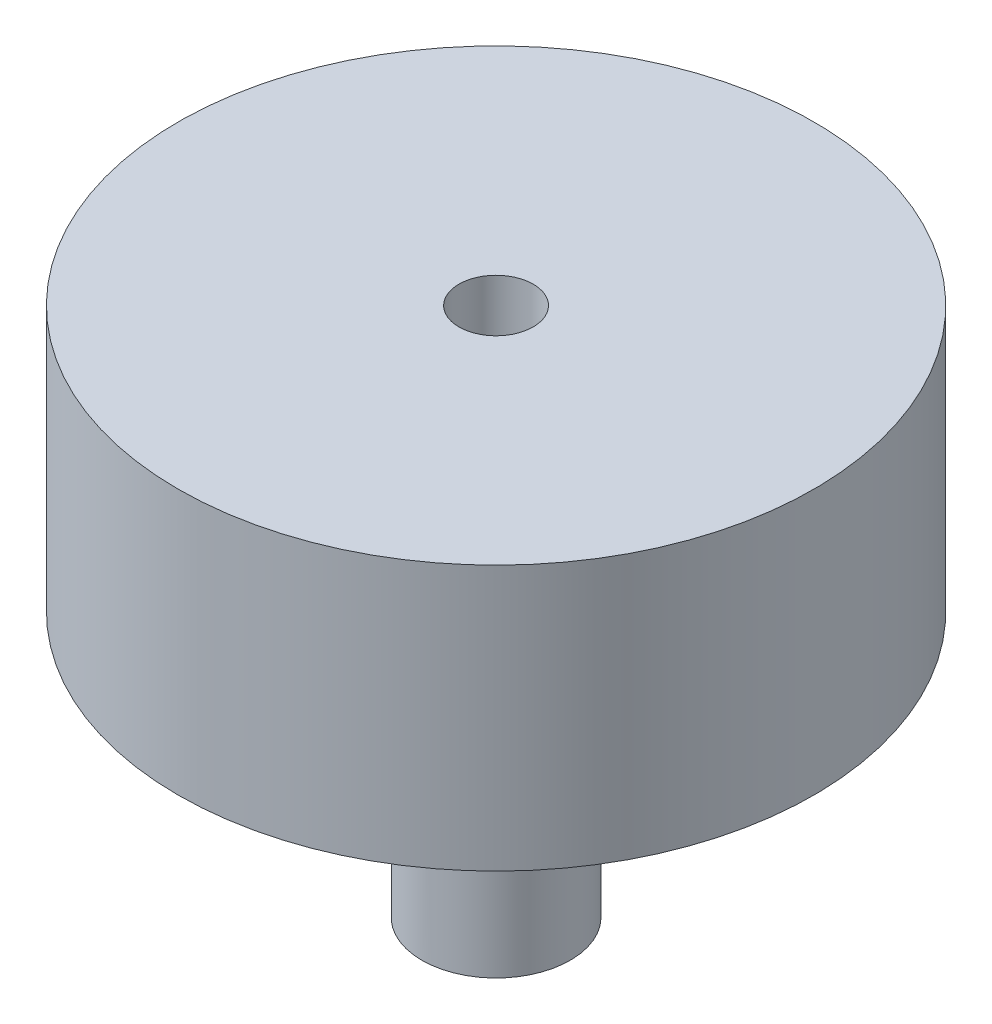
ISO-10303-21;
HEADER;
FILE_DESCRIPTION(('STEP AP214'),'2;1');
FILE_NAME('part.step','',(''),(''),'','','');
FILE_SCHEMA(('AUTOMOTIVE_DESIGN { 1 0 10303 214 1 1 1 1 }'));
ENDSEC;
DATA;
#1=APPLICATION_CONTEXT('core data for automotive mechanical design processes');
#2=APPLICATION_PROTOCOL_DEFINITION('international standard','automotive_design',2000,#1);
#3=PRODUCT_CONTEXT('',#1,'mechanical');
#4=PRODUCT('Part','Part','',(#3));
#5=PRODUCT_RELATED_PRODUCT_CATEGORY('part','',(#4));
#6=PRODUCT_DEFINITION_FORMATION('','',#4);
#7=PRODUCT_DEFINITION_CONTEXT('part definition',#1,'design');
#8=PRODUCT_DEFINITION('design','',#6,#7);
#9=PRODUCT_DEFINITION_SHAPE('','',#8);
#10=(LENGTH_UNIT() NAMED_UNIT(*) SI_UNIT(.MILLI.,.METRE.));
#11=(NAMED_UNIT(*) PLANE_ANGLE_UNIT() SI_UNIT($,.RADIAN.));
#12=(NAMED_UNIT(*) SI_UNIT($,.STERADIAN.) SOLID_ANGLE_UNIT());
#13=UNCERTAINTY_MEASURE_WITH_UNIT(LENGTH_MEASURE(1.E-05),#10,'distance_accuracy_value','');
#14=(GEOMETRIC_REPRESENTATION_CONTEXT(3) GLOBAL_UNCERTAINTY_ASSIGNED_CONTEXT((#13)) GLOBAL_UNIT_ASSIGNED_CONTEXT((#10,
#11,#12)) REPRESENTATION_CONTEXT('',''));
#15=CARTESIAN_POINT('',(0.,0.,0.));
#16=DIRECTION('',(0.,0.,1.));
#17=DIRECTION('',(1.,0.,0.));
#18=AXIS2_PLACEMENT_3D('',#15,#16,#17);
#19=CARTESIAN_POINT('',(0.,25.,0.));
#20=DIRECTION('',(0.,-1.,0.));
#21=DIRECTION('',(0.,0.,-1.));
#22=AXIS2_PLACEMENT_3D('',#19,#20,#21);
#23=CYLINDRICAL_SURFACE('',#22,30.);
#24=CARTESIAN_POINT('',(0.,25.,0.));
#25=DIRECTION('',(0.,1.,0.));
#26=DIRECTION('',(0.,0.,1.));
#27=AXIS2_PLACEMENT_3D('',#24,#25,#26);
#28=CIRCLE('',#27,30.);
#29=CARTESIAN_POINT('',(0.,25.,30.));
#30=VERTEX_POINT('',#29);
#31=EDGE_CURVE('E122',#30,#30,#28,.T.);
#32=ORIENTED_EDGE('',*,*,#31,.F.);
#33=EDGE_LOOP('',(#32));
#34=FACE_BOUND('',#33,.T.);
#35=CARTESIAN_POINT('',(0.,0.,0.));
#36=DIRECTION('',(0.,1.,0.));
#37=DIRECTION('',(0.,0.,1.));
#38=AXIS2_PLACEMENT_3D('',#35,#36,#37);
#39=CIRCLE('',#38,30.);
#40=CARTESIAN_POINT('',(0.,0.,30.));
#41=VERTEX_POINT('',#40);
#42=EDGE_CURVE('E123',#41,#41,#39,.T.);
#43=ORIENTED_EDGE('',*,*,#42,.T.);
#44=EDGE_LOOP('',(#43));
#45=FACE_BOUND('',#44,.T.);
#46=ADVANCED_FACE('F44',(#34,#45),#23,.T.);
#47=CARTESIAN_POINT('',(0.,25.,0.));
#48=DIRECTION('',(0.,1.,0.));
#49=DIRECTION('',(0.,0.,1.));
#50=AXIS2_PLACEMENT_3D('',#47,#48,#49);
#51=PLANE('',#50);
#52=CARTESIAN_POINT('',(0.,25.,0.));
#53=DIRECTION('',(0.,1.,0.));
#54=DIRECTION('',(0.,0.,1.));
#55=AXIS2_PLACEMENT_3D('',#52,#53,#54);
#56=CIRCLE('',#55,3.5);
#57=CARTESIAN_POINT('',(0.,25.,3.5));
#58=VERTEX_POINT('',#57);
#59=EDGE_CURVE('E127',#58,#58,#56,.T.);
#60=ORIENTED_EDGE('',*,*,#59,.F.);
#61=EDGE_LOOP('',(#60));
#62=FACE_BOUND('',#61,.T.);
#63=ORIENTED_EDGE('',*,*,#31,.T.);
#64=EDGE_LOOP('',(#63));
#65=FACE_BOUND('',#64,.T.);
#66=ADVANCED_FACE('F177',(#62,#65),#51,.T.);
#67=CARTESIAN_POINT('',(0.,0.,0.));
#68=DIRECTION('',(0.,1.,0.));
#69=DIRECTION('',(0.,0.,1.));
#70=AXIS2_PLACEMENT_3D('',#67,#68,#69);
#71=PLANE('',#70);
#72=CARTESIAN_POINT('',(0.,0.,0.));
#73=DIRECTION('',(0.,1.,0.));
#74=DIRECTION('',(0.,0.,1.));
#75=AXIS2_PLACEMENT_3D('',#72,#73,#74);
#76=CIRCLE('',#75,7.);
#77=CARTESIAN_POINT('',(0.,0.,7.));
#78=VERTEX_POINT('',#77);
#79=EDGE_CURVE('E135',#78,#78,#76,.T.);
#80=ORIENTED_EDGE('',*,*,#79,.T.);
#81=EDGE_LOOP('',(#80));
#82=FACE_BOUND('',#81,.T.);
#83=ORIENTED_EDGE('',*,*,#42,.F.);
#84=EDGE_LOOP('',(#83));
#85=FACE_BOUND('',#84,.T.);
#86=ADVANCED_FACE('F182',(#82,#85),#71,.F.);
#87=CARTESIAN_POINT('',(0.,25.,0.));
#88=DIRECTION('',(0.,-1.,0.));
#89=DIRECTION('',(0.,0.,-1.));
#90=AXIS2_PLACEMENT_3D('',#87,#88,#89);
#91=CYLINDRICAL_SURFACE('',#90,3.5);
#92=CARTESIAN_POINT('',(0.,-7.96884638808662,-3.5));
#93=CARTESIAN_POINT('',(-0.0663689307559183,-7.9688468525204,-3.49999955674576));
#94=CARTESIAN_POINT('',(-0.132745851858584,-7.97125490202433,-3.49810639539016));
#95=CARTESIAN_POINT('',(-0.264952535682278,-7.98083526335431,-3.49058704511513));
#96=CARTESIAN_POINT('',(-0.330782010081833,-7.98800994233119,-3.48495900142128));
#97=CARTESIAN_POINT('',(-0.526828755623839,-8.01656052757094,-3.46261392789626));
#98=CARTESIAN_POINT('',(-0.655497673920044,-8.0449627296225,-3.44043623430095));
#99=CARTESIAN_POINT('',(-0.903979204255256,-8.11844983201693,-3.38364111689331));
#100=CARTESIAN_POINT('',(-1.02384164344569,-8.16343052660782,-3.34910143400016));
#101=CARTESIAN_POINT('',(-1.25345411311455,-8.26787392684999,-3.27010728298878));
#102=CARTESIAN_POINT('',(-1.36320378923318,-8.32733713971522,-3.22565246762246));
#103=CARTESIAN_POINT('',(-1.60678109688964,-8.48099874718022,-3.11317241900944));
#104=CARTESIAN_POINT('',(-1.73615288293255,-8.5801381605604,-3.04226635425376));
#105=CARTESIAN_POINT('',(-1.97392531209018,-8.79734275962837,-2.89366827121686));
#106=CARTESIAN_POINT('',(-2.08226415215584,-8.91546191072364,-2.81595719971648));
#107=CARTESIAN_POINT('',(-2.22900537779148,-9.10621424675357,-2.69917398223201));
#108=CARTESIAN_POINT('',(-2.27557746649745,-9.17260694493018,-2.65991707813009));
#109=CARTESIAN_POINT('',(-2.36298028675325,-9.30978855803772,-2.58258060610051));
#110=CARTESIAN_POINT('',(-2.40380928734208,-9.38057878915228,-2.54450139581487));
#111=CARTESIAN_POINT('',(-2.47934895939843,-9.52635015002784,-2.47095128139155));
#112=CARTESIAN_POINT('',(-2.51407681447756,-9.60131869982229,-2.43547322119008));
#113=CARTESIAN_POINT('',(-2.57713192252029,-9.75560652540577,-2.36864934193178));
#114=CARTESIAN_POINT('',(-2.60546454030521,-9.83492208463812,-2.3373000685938));
#115=CARTESIAN_POINT('',(-2.65950617243312,-10.0120790425032,-2.27573876931547));
#116=CARTESIAN_POINT('',(-2.68390056317434,-10.1107423478874,-2.24667406216111));
#117=CARTESIAN_POINT('',(-2.72178334536306,-10.3127602759132,-2.20063763936689));
#118=CARTESIAN_POINT('',(-2.73529766280693,-10.4161031227313,-2.18363718749645));
#119=CARTESIAN_POINT('',(-2.75045032098895,-10.6259013225106,-2.16453132459079));
#120=CARTESIAN_POINT('',(-2.75199890269644,-10.7323741970487,-2.16253849361484));
#121=CARTESIAN_POINT('',(-2.74282110231918,-10.9439672091836,-2.17415991412245));
#122=CARTESIAN_POINT('',(-2.7320820562901,-11.0490858380599,-2.18779026728571));
#123=CARTESIAN_POINT('',(-2.6963370852446,-11.2732660665229,-2.23174355084619));
#124=CARTESIAN_POINT('',(-2.66911901922294,-11.3914497544468,-2.264620509936));
#125=CARTESIAN_POINT('',(-2.60100940682524,-11.6196936188005,-2.34252027429974));
#126=CARTESIAN_POINT('',(-2.56007916669684,-11.7297297187969,-2.38757737990307));
#127=CARTESIAN_POINT('',(-2.4791032347045,-11.9119742478898,-2.47112354838105));
#128=CARTESIAN_POINT('',(-2.44192518355214,-11.9862474643697,-2.50799828509982));
#129=CARTESIAN_POINT('',(-2.36154242687047,-12.1303814662976,-2.58382839291192));
#130=CARTESIAN_POINT('',(-2.31833522573235,-12.200240407086,-2.62278462144266));
#131=CARTESIAN_POINT('',(-2.22607161751133,-12.3355754202702,-2.70153378026052));
#132=CARTESIAN_POINT('',(-2.17701091219505,-12.4010482161436,-2.74132730749665));
#133=CARTESIAN_POINT('',(-2.0731837682114,-12.5274675559064,-2.82067280009189));
#134=CARTESIAN_POINT('',(-2.0184144363639,-12.5884117776125,-2.86022463210284));
#135=CARTESIAN_POINT('',(-1.84334641307315,-12.7664285318673,-2.97860475868732));
#136=CARTESIAN_POINT('',(-1.71397695457649,-12.876189158303,-3.05564244130566));
#137=CARTESIAN_POINT('',(-1.50334336718463,-13.0231409502109,-3.16167059943222));
#138=CARTESIAN_POINT('',(-1.43042358498028,-13.0691516571771,-3.19540574897199));
#139=CARTESIAN_POINT('',(-1.27926117148675,-13.1547304719103,-3.25886481619874));
#140=CARTESIAN_POINT('',(-1.20102090107279,-13.1943014111041,-3.28859049577355));
#141=CARTESIAN_POINT('',(-1.00634893201562,-13.2811317987198,-3.35435560570937));
#142=CARTESIAN_POINT('',(-0.887456974965987,-13.3248478704648,-3.38795484078339));
#143=CARTESIAN_POINT('',(-0.642194706084428,-13.3958521708986,-3.44286983605808));
#144=CARTESIAN_POINT('',(-0.515830176077425,-13.4231529227322,-3.46419495956923));
#145=CARTESIAN_POINT('',(-0.258336383600438,-13.459782392589,-3.49286377870533));
#146=CARTESIAN_POINT('',(-0.127188704924069,-13.4690320141664,-3.50014593922883));
#147=CARTESIAN_POINT('',(0.135062368324877,-13.4686551261627,-3.49984963261285));
#148=CARTESIAN_POINT('',(0.266165764605362,-13.4590294547985,-3.49227182537723));
#149=CARTESIAN_POINT('',(0.515332140161941,-13.4228652585703,-3.46397237983086));
#150=CARTESIAN_POINT('',(0.633678193687238,-13.3975114805152,-3.44417191039282));
#151=CARTESIAN_POINT('',(0.86387599060632,-13.3323766313553,-3.39376136448812));
#152=CARTESIAN_POINT('',(0.975726168455456,-13.2925920989547,-3.36314869470215));
#153=CARTESIAN_POINT('',(1.19927940129709,-13.1967769085335,-3.29037871453037));
#154=CARTESIAN_POINT('',(1.31031455411094,-13.1397350328594,-3.24751656956845));
#155=CARTESIAN_POINT('',(1.52135639305891,-13.0130017161742,-3.15417380619628));
#156=CARTESIAN_POINT('',(1.62135803305665,-12.9433045255375,-3.1036897267149));
#157=CARTESIAN_POINT('',(1.82807075152817,-12.7783110278597,-2.98744135758463));
#158=CARTESIAN_POINT('',(1.93230977909347,-12.6806720727368,-2.9206140746065));
#159=CARTESIAN_POINT('',(2.12394335506473,-12.4714265240073,-2.78436712815443));
#160=CARTESIAN_POINT('',(2.21131422931744,-12.3598006569305,-2.71494398211293));
#161=CARTESIAN_POINT('',(2.36644459441577,-12.1265209486864,-2.5807271944638));
#162=CARTESIAN_POINT('',(2.43467309350052,-12.0052226911315,-2.51585897979468));
#163=CARTESIAN_POINT('',(2.55326000476044,-11.7499091195526,-2.39540598250408));
#164=CARTESIAN_POINT('',(2.60365593983523,-11.6159212694308,-2.33980183875234));
#165=CARTESIAN_POINT('',(2.67124246216731,-11.3798383052066,-2.26191391260786));
#166=CARTESIAN_POINT('',(2.69389207681612,-11.2809875896611,-2.23465139676664));
#167=CARTESIAN_POINT('',(2.72824327520216,-11.0789027836942,-2.19258794043651));
#168=CARTESIAN_POINT('',(2.73996938067557,-10.9756790577804,-2.17775909563087));
#169=CARTESIAN_POINT('',(2.75158018375908,-10.7667817486292,-2.16307995222684));
#170=CARTESIAN_POINT('',(2.75138955747548,-10.6610968035945,-2.16332493289021));
#171=CARTESIAN_POINT('',(2.73899588244782,-10.4515301337403,-2.17898639546662));
#172=CARTESIAN_POINT('',(2.72677791202377,-10.3476508119839,-2.19442172322104));
#173=CARTESIAN_POINT('',(2.6875075689477,-10.1225603231924,-2.24241724298109));
#174=CARTESIAN_POINT('',(2.65781277452482,-10.0024759033199,-2.27796526181279));
#175=CARTESIAN_POINT('',(2.58434388865647,-9.77094707984413,-2.36097786847794));
#176=CARTESIAN_POINT('',(2.54052976805334,-9.65952837245666,-2.40847625135938));
#177=CARTESIAN_POINT('',(2.45461254712709,-9.47606055713991,-2.49549625806365));
#178=CARTESIAN_POINT('',(2.41554298398386,-9.40180223062874,-2.53346405838472));
#179=CARTESIAN_POINT('',(2.3312735362613,-9.25780974618303,-2.61121600224405));
#180=CARTESIAN_POINT('',(2.28607124835248,-9.18807737782663,-2.65100085378427));
#181=CARTESIAN_POINT('',(2.1896973638771,-9.05313368781148,-2.73114512424909));
#182=CARTESIAN_POINT('',(2.13852207877145,-8.98792519985877,-2.77150488455124));
#183=CARTESIAN_POINT('',(2.03033435488217,-8.86220070621393,-2.85171803965754));
#184=CARTESIAN_POINT('',(1.97331894454349,-8.8016871171619,-2.89157116496826));
#185=CARTESIAN_POINT('',(1.79181392145389,-8.62588271942105,-3.01004657051437));
#186=CARTESIAN_POINT('',(1.65814272100985,-8.51813118378004,-3.08646909531278));
#187=CARTESIAN_POINT('',(1.44096025937673,-8.37499414644068,-3.19062818689933));
#188=CARTESIAN_POINT('',(1.36583358393018,-8.33038333887381,-3.22358656266395));
#189=CARTESIAN_POINT('',(1.21028438942091,-8.2479250941405,-3.28514727753859));
#190=CARTESIAN_POINT('',(1.12986484364069,-8.21007390338057,-3.31375203288795));
#191=CARTESIAN_POINT('',(0.932982596255152,-8.12901191429157,-3.37547228620095));
#192=CARTESIAN_POINT('',(0.814356641745714,-8.08915564490246,-3.40622619121016));
#193=CARTESIAN_POINT('',(0.570561333235447,-8.02575566388843,-3.45540645558367));
#194=CARTESIAN_POINT('',(0.44540942448961,-8.00217064095202,-3.47386403015681));
#195=CARTESIAN_POINT('',(0.265993880308742,-7.98122205318337,-3.49028324624073));
#196=CARTESIAN_POINT('',(0.212983557365911,-7.97658841517021,-3.49391989113823));
#197=CARTESIAN_POINT('',(0.106650589565196,-7.97040003370023,-3.4987787302368));
#198=CARTESIAN_POINT('',(0.0533278741578678,-7.96884601491101,-3.5000003561577));
#199=CARTESIAN_POINT('',(0.,-7.96884638808662,-3.5));
#200=B_SPLINE_CURVE_WITH_KNOTS('',3,(#92,#93,#94,#95,#96,#97,#98,#99,#100,#101,#102,#103,#104,
#105,#106,#107,#108,#109,#110,#111,#112,#113,#114,#115,#116,#117,#118,#119,#120,#121,#122,#123,
#124,#125,#126,#127,#128,#129,#130,#131,#132,#133,#134,#135,#136,#137,#138,#139,#140,#141,#142,
#143,#144,#145,#146,#147,#148,#149,#150,#151,#152,#153,#154,#155,#156,#157,#158,#159,#160,#161,
#162,#163,#164,#165,#166,#167,#168,#169,#170,#171,#172,#173,#174,#175,#176,#177,#178,#179,#180,
#181,#182,#183,#184,#185,#186,#187,#188,#189,#190,#191,#192,#193,#194,#195,#196,#197,#198,#199),
.UNSPECIFIED.,.T.,.F.,(4,2,2,2,2,2,2,2,2,2,2,2,2,2,2,2,2,2,2,2,2,2,2,2,2,2,2,2,2,2,2,2,2,2,2,2,
2,2,2,2,2,2,2,2,2,2,2,2,2,2,2,2,2,4),(0.,0.199043272259862,0.398185465150315,0.796785152029354,
1.19292097971004,1.58907068305215,2.1195602224851,2.65158570796779,2.92165031863625,
3.19179615289203,3.46116849070694,3.73031401127351,4.04629771396656,4.36152621557354,
4.67911707863228,4.99703555403529,5.37193647675608,5.74790435324466,6.02021124483992,
6.29263118695108,6.56525241286236,6.83801248359776,7.39354491281026,7.67093795320638,
7.94820869842601,8.33964945909515,8.73079121190766,9.12364305529548,9.51647745325012,
9.88281122740591,10.249232926895,10.6437298409354,11.0384064352836,11.5097734042398,
11.9817971943423,12.4409749770508,12.8991807403451,13.2130895082396,13.5262918850204,
13.841474166518,14.1570479711964,14.5410578785996,14.9261661995472,15.2021434050526,
15.4782290762703,15.7544861514136,16.0308844957586,16.5910247771717,16.8707815939511,
17.1503825763228,17.5353370112185,17.919310446643,18.0792054098282,18.239137993556),.UNSPECIFIED.);
#201=CARTESIAN_POINT('',(0.,-7.96884638808662,-3.5));
#202=VERTEX_POINT('',#201);
#203=EDGE_CURVE('E47',#202,#202,#200,.T.);
#204=ORIENTED_EDGE('',*,*,#203,.F.);
#205=EDGE_LOOP('',(#204));
#206=FACE_BOUND('',#205,.T.);
#207=CARTESIAN_POINT('',(2.74999999999999,-10.7188463880866,2.1650635094611));
#208=CARTESIAN_POINT('',(2.74999421060021,-10.8244799476449,2.16507653399449));
#209=CARTESIAN_POINT('',(2.74384483620531,-10.9303046040338,2.17295093110775));
#210=CARTESIAN_POINT('',(2.71980787817356,-11.1386563794942,2.2029488399375));
#211=CARTESIAN_POINT('',(2.70188108027468,-11.2411712778052,2.22511994960116));
#212=CARTESIAN_POINT('',(2.64783035698246,-11.4739228268588,2.28938054610227));
#213=CARTESIAN_POINT('',(2.60763555137901,-11.6020287356172,2.33564359685731));
#214=CARTESIAN_POINT('',(2.51122430149723,-11.8474478905266,2.43900547643055));
#215=CARTESIAN_POINT('',(2.4549648815926,-11.9647310551685,2.49613323143862));
#216=CARTESIAN_POINT('',(2.34914275893423,-12.1510987000196,2.5951702245577));
#217=CARTESIAN_POINT('',(2.30360920816236,-12.2232078693588,2.63579709404205));
#218=CARTESIAN_POINT('',(2.20628490214582,-12.3626359705403,2.71778629665323));
#219=CARTESIAN_POINT('',(2.15449206517827,-12.4299532968108,2.75914887053965));
#220=CARTESIAN_POINT('',(1.98998253430013,-12.6244387799983,2.88247718473637));
#221=CARTESIAN_POINT('',(1.86797759612949,-12.7444163685149,2.96383888634129));
#222=CARTESIAN_POINT('',(1.62580894286708,-12.9411641445954,3.10199120201574));
#223=CARTESIAN_POINT('',(1.50975371961843,-13.0218094931213,3.16050538206092));
#224=CARTESIAN_POINT('',(1.2629782779793,-13.1658261757584,3.26693248391722));
#225=CARTESIAN_POINT('',(1.1322808063371,-13.2292237929884,3.31486151478893));
#226=CARTESIAN_POINT('',(0.880028118888101,-13.3271741927934,3.38969740161406));
#227=CARTESIAN_POINT('',(0.760259433298403,-13.3646930112718,3.41872339296452));
#228=CARTESIAN_POINT('',(0.514439564974251,-13.4232467216644,3.4642369079187));
#229=CARTESIAN_POINT('',(0.388391782393318,-13.4442904338905,3.48073114053615));
#230=CARTESIAN_POINT('',(0.133116545297403,-13.4686218986585,3.49981534128643));
#231=CARTESIAN_POINT('',(0.00388028295283507,-13.4718531915799,3.50236109709534));
#232=CARTESIAN_POINT('',(-0.253256643772844,-13.4601831697049,3.49319545199565));
#233=CARTESIAN_POINT('',(-0.381157200217859,-13.4452804007876,3.48148290775304));
#234=CARTESIAN_POINT('',(-0.625521484331011,-13.3995036009322,3.44575569132872));
#235=CARTESIAN_POINT('',(-0.742237972293572,-13.3694562975597,3.42237839119145));
#236=CARTESIAN_POINT('',(-0.968471262142991,-13.2954225210544,3.36536600019376));
#237=CARTESIAN_POINT('',(-1.07798630052666,-13.2514326488774,3.33172840806289));
#238=CARTESIAN_POINT('',(-1.29870487770084,-13.1462476485435,3.25245448815767));
#239=CARTESIAN_POINT('',(-1.40898203755629,-13.0837718608251,3.20595464224729));
#240=CARTESIAN_POINT('',(-1.61776068256568,-12.9461783705329,3.10584609413732));
#241=CARTESIAN_POINT('',(-1.71625457612567,-12.8710525921903,3.05223285540503));
#242=CARTESIAN_POINT('',(-1.91986787709236,-12.6932909990915,2.92932995450584));
#243=CARTESIAN_POINT('',(-2.0222323931581,-12.5881702836197,2.85907487110502));
#244=CARTESIAN_POINT('',(-2.20889846684556,-12.3634279708912,2.71744121125765));
#245=CARTESIAN_POINT('',(-2.29318134386281,-12.2437915749209,2.64606155390614));
#246=CARTESIAN_POINT('',(-2.43293587882438,-12.0071182610871,2.5176576371447));
#247=CARTESIAN_POINT('',(-2.49074065139935,-11.8918164997186,2.45998121780893));
#248=CARTESIAN_POINT('',(-2.59068885257013,-11.6504129177167,2.35448388691054));
#249=CARTESIAN_POINT('',(-2.63286683198283,-11.5243356910513,2.30664133829956));
#250=CARTESIAN_POINT('',(-2.69023475396498,-11.2975282492137,2.23920957596705));
#251=CARTESIAN_POINT('',(-2.70963496411836,-11.1991279341411,2.21548067953325));
#252=CARTESIAN_POINT('',(-2.73758998210957,-10.9986572975715,2.18085191804827));
#253=CARTESIAN_POINT('',(-2.74616616954523,-10.8965946215789,2.16992676611514));
#254=CARTESIAN_POINT('',(-2.75178568462269,-10.6911831462533,2.16280049158902));
#255=CARTESIAN_POINT('',(-2.74878130161343,-10.5878307786405,2.16666028088721));
#256=CARTESIAN_POINT('',(-2.73141599089901,-10.3835597989498,2.18850189441791));
#257=CARTESIAN_POINT('',(-2.71703825067085,-10.2826450179699,2.20650462500528));
#258=CARTESIAN_POINT('',(-2.67230845744627,-10.0569557204707,2.26059839817856));
#259=CARTESIAN_POINT('',(-2.63852369593237,-9.93379141026441,2.30043035602117));
#260=CARTESIAN_POINT('',(-2.55616431502487,-9.69691022865574,2.39160719200592));
#261=CARTESIAN_POINT('',(-2.50754428320863,-9.583223749869,2.44298729128824));
#262=CARTESIAN_POINT('',(-2.41364962463595,-9.39821081082283,2.53520246357614));
#263=CARTESIAN_POINT('',(-2.37174011906208,-9.3244010658931,2.57458237926902));
#264=CARTESIAN_POINT('',(-2.28168866192506,-9.18146624053012,2.65471973379172));
#265=CARTESIAN_POINT('',(-2.2335442926995,-9.11234299328115,2.69547770242839));
#266=CARTESIAN_POINT('',(-2.08003593314154,-8.91212604391724,2.81789109127078));
#267=CARTESIAN_POINT('',(-1.96549546719253,-8.78798734343029,2.89979129518596));
#268=CARTESIAN_POINT('',(-1.73215160762931,-8.57808584710026,3.04393606529587));
#269=CARTESIAN_POINT('',(-1.61667150236581,-8.48935761038335,3.10727214269808));
#270=CARTESIAN_POINT('',(-1.36950976180943,-8.32959922240911,3.22381952814018));
#271=CARTESIAN_POINT('',(-1.23785590917642,-8.25853933904538,3.27704780930102));
#272=CARTESIAN_POINT('',(-0.984645429245062,-8.14813116038716,3.36080819718354));
#273=CARTESIAN_POINT('',(-0.865339549804107,-8.10541224862285,3.39368041016449));
#274=CARTESIAN_POINT('',(-0.619375346147684,-8.03646881288844,3.447052132668));
#275=CARTESIAN_POINT('',(-0.49272125041315,-8.01023490357729,3.46755868201574));
#276=CARTESIAN_POINT('',(-0.234931953158334,-7.97580481857419,3.49451866669702));
#277=CARTESIAN_POINT('',(-0.103780426395628,-7.96768347250111,3.50091380147046));
#278=CARTESIAN_POINT('',(0.158217011939176,-7.97027870493112,3.4988745281022));
#279=CARTESIAN_POINT('',(0.289062940265998,-7.98099422519683,3.49044095302342));
#280=CARTESIAN_POINT('',(0.537617136652256,-8.01917414066489,3.46057842340759));
#281=CARTESIAN_POINT('',(0.655619574646012,-8.04547374378932,3.44005375738522));
#282=CARTESIAN_POINT('',(0.88498657667709,-8.11239586369902,3.38830861533256));
#283=CARTESIAN_POINT('',(0.996349527478681,-8.15302184500271,3.35708555218283));
#284=CARTESIAN_POINT('',(1.21931410171824,-8.25069369436643,3.28301384971303));
#285=CARTESIAN_POINT('',(1.33019719035394,-8.30880699689725,3.23942574336108));
#286=CARTESIAN_POINT('',(1.54078748792655,-8.43767623398496,3.14473019134213));
#287=CARTESIAN_POINT('',(1.64048920526816,-8.50843833697719,3.09361907909091));
#288=CARTESIAN_POINT('',(1.84661485995307,-8.67594101899024,2.97602272322323));
#289=CARTESIAN_POINT('',(1.95050920407245,-8.77505403927082,2.90849009426576));
#290=CARTESIAN_POINT('',(2.14121425214559,-8.98734293418009,2.77110488979064));
#291=CARTESIAN_POINT('',(2.22800261909976,-9.10053688537808,2.70124941831968));
#292=CARTESIAN_POINT('',(2.38003245389598,-9.33448057987501,2.56809968010702));
#293=CARTESIAN_POINT('',(2.44611814998561,-9.45459285938629,2.50465157196025));
#294=CARTESIAN_POINT('',(2.56089957665878,-9.70718828943055,2.3871552073875));
#295=CARTESIAN_POINT('',(2.60962683387479,-9.83964845556647,2.33309000217982));
#296=CARTESIAN_POINT('',(2.67565613227835,-10.0756881983863,2.2566879729119));
#297=CARTESIAN_POINT('',(2.69798447563221,-10.1763255260353,2.2296961702982));
#298=CARTESIAN_POINT('',(2.73124845776873,-10.3819183324029,2.18883633793107));
#299=CARTESIAN_POINT('',(2.74222705996176,-10.4868559518638,2.17491883502198));
#300=CARTESIAN_POINT('',(2.74805967592577,-10.6134084082727,2.16752544873527));
#301=CARTESIAN_POINT('',(2.74878627389119,-10.634475709643,2.16660446152517));
#302=CARTESIAN_POINT('',(2.74975704676365,-10.6766415911376,2.16537214968077));
#303=CARTESIAN_POINT('',(2.75000115675648,-10.6977401750886,2.16506090708193));
#304=CARTESIAN_POINT('',(2.74999999999999,-10.7188463880866,2.1650635094611));
#305=B_SPLINE_CURVE_WITH_KNOTS('',3,(#207,#208,#209,#210,#211,#212,#213,#214,#215,#216,#217,
#218,#219,#220,#221,#222,#223,#224,#225,#226,#227,#228,#229,#230,#231,#232,#233,#234,#235,#236,
#237,#238,#239,#240,#241,#242,#243,#244,#245,#246,#247,#248,#249,#250,#251,#252,#253,#254,#255,
#256,#257,#258,#259,#260,#261,#262,#263,#264,#265,#266,#267,#268,#269,#270,#271,#272,#273,#274,
#275,#276,#277,#278,#279,#280,#281,#282,#283,#284,#285,#286,#287,#288,#289,#290,#291,#292,#293,
#294,#295,#296,#297,#298,#299,#300,#301,#302,#303,#304),.UNSPECIFIED.,.T.,.F.,(4,2,2,2,2,2,2,2,
2,2,2,2,2,2,2,2,2,2,2,2,2,2,2,2,2,2,2,2,2,2,2,2,2,2,2,2,2,2,2,2,2,2,2,2,2,2,2,2,4),(0.,
0.316807910580574,0.634676051660908,1.05834967566017,1.48316749246629,1.76623682419432,
2.04940055997788,2.61467975906858,3.07187321737077,3.52836602423302,3.91318513269716,
4.29779807860371,4.68362942545054,5.06949171309425,5.43626189940033,5.80312156908767,
6.20666863202583,6.61047430346774,7.09674740813589,7.58352050017588,8.00614471870893,
8.42782885909678,8.73583054487901,9.04322290908237,9.35188304625539,9.6610003109954,
10.0601400150416,10.4605140008531,10.7408852966342,11.0213656379785,11.5815972922534,
12.0562592191987,12.5301169005729,12.9212359317228,13.3121320863984,13.7046402076359,
14.0971262788422,14.4634341779337,14.8298307213231,15.2260535058066,15.6224700458881,
16.0967922273678,16.5717297344494,17.0235113195793,17.4744681384944,17.7929927176227,
18.1103070862887,18.1735986749591,18.2368987783366),.UNSPECIFIED.);
#306=CARTESIAN_POINT('',(2.74999999999999,-10.7188463880866,2.1650635094611));
#307=VERTEX_POINT('',#306);
#308=EDGE_CURVE('E148',#307,#307,#305,.T.);
#309=ORIENTED_EDGE('',*,*,#308,.F.);
#310=EDGE_LOOP('',(#309));
#311=FACE_BOUND('',#310,.T.);
#312=ORIENTED_EDGE('',*,*,#59,.T.);
#313=EDGE_LOOP('',(#312));
#314=FACE_BOUND('',#313,.T.);
#315=CARTESIAN_POINT('',(0.,-25.,0.));
#316=DIRECTION('',(0.,1.,0.));
#317=DIRECTION('',(0.,0.,1.));
#318=AXIS2_PLACEMENT_3D('',#315,#316,#317);
#319=CIRCLE('',#318,3.5);
#320=CARTESIAN_POINT('',(0.,-25.,3.5));
#321=VERTEX_POINT('',#320);
#322=EDGE_CURVE('E139',#321,#321,#319,.T.);
#323=ORIENTED_EDGE('',*,*,#322,.F.);
#324=EDGE_LOOP('',(#323));
#325=FACE_BOUND('',#324,.T.);
#326=ADVANCED_FACE('F160',(#206,#311,#314,#325),#91,.F.);
#327=CARTESIAN_POINT('',(0.,-25.,0.));
#328=DIRECTION('',(0.,1.,0.));
#329=DIRECTION('',(0.,0.,1.));
#330=AXIS2_PLACEMENT_3D('',#327,#328,#329);
#331=CYLINDRICAL_SURFACE('',#330,7.);
#332=CARTESIAN_POINT('',(2.74999999999999,-10.7188463880866,-6.43719659479187));
#333=CARTESIAN_POINT('',(2.74999421560116,-10.8663859728578,-6.43720218799831));
#334=CARTESIAN_POINT('',(2.73805558414687,-11.0141786617956,-6.44233942228015));
#335=CARTESIAN_POINT('',(2.69076206518873,-11.3055228198805,-6.46223103868111));
#336=CARTESIAN_POINT('',(2.65534606722874,-11.4490621964895,-6.47701051750538));
#337=CARTESIAN_POINT('',(2.56263366830743,-11.7272184613905,-6.51424375927953));
#338=CARTESIAN_POINT('',(2.50541787277365,-11.8618661005203,-6.53666921923867));
#339=CARTESIAN_POINT('',(2.3709675854508,-12.1196161430043,-6.58662552300429));
#340=CARTESIAN_POINT('',(2.29373799115191,-12.2427213608322,-6.6141551173318));
#341=CARTESIAN_POINT('',(2.11689454404881,-12.480754802789,-6.6729190318712));
#342=CARTESIAN_POINT('',(2.01635480119877,-12.5949667619228,-6.70426974822759));
#343=CARTESIAN_POINT('',(1.79769565359038,-12.8054295275123,-6.76618010028724));
#344=CARTESIAN_POINT('',(1.67957024221386,-12.9016741715767,-6.79673946148942));
#345=CARTESIAN_POINT('',(1.42360048579307,-13.0769836419723,-6.85501328506291));
#346=CARTESIAN_POINT('',(1.28517936671401,-13.1552611433819,-6.88257645947327));
#347=CARTESIAN_POINT('',(0.995858182782095,-13.2871162100955,-6.93034747925908));
#348=CARTESIAN_POINT('',(0.844963053756,-13.3407034903922,-6.95055821697709));
#349=CARTESIAN_POINT('',(0.542482052828629,-13.4191178421641,-6.98052391875021));
#350=CARTESIAN_POINT('',(0.391260232155459,-13.4451754884584,-6.99072465574785));
#351=CARTESIAN_POINT('',(0.0862693049481269,-13.4717476675445,-7.00112888707599));
#352=CARTESIAN_POINT('',(-0.0674988665095074,-13.4722713776356,-7.00133597328188));
#353=CARTESIAN_POINT('',(-0.364344066619362,-13.4484477994498,-6.99200445395777));
#354=CARTESIAN_POINT('',(-0.507548749203794,-13.4254473562704,-6.98299360369506));
#355=CARTESIAN_POINT('',(-0.78787658737699,-13.3575118490252,-6.95694445932343));
#356=CARTESIAN_POINT('',(-0.924999297307218,-13.3125751804623,-6.93990557801765));
#357=CARTESIAN_POINT('',(-1.19171662510718,-13.2014862339692,-6.8991521296457));
#358=CARTESIAN_POINT('',(-1.32116803781767,-13.1350268040667,-6.87534156246171));
#359=CARTESIAN_POINT('',(-1.56741211266467,-12.9830617593535,-6.82342132808234));
#360=CARTESIAN_POINT('',(-1.68420048478557,-12.8975497196398,-6.79531021166432));
#361=CARTESIAN_POINT('',(-1.9096858458574,-12.7035628853994,-6.73554465819886));
#362=CARTESIAN_POINT('',(-2.01739586727094,-12.5939735781102,-6.70377857423215));
#363=CARTESIAN_POINT('',(-2.2133041523784,-12.358143382541,-6.64167673320092));
#364=CARTESIAN_POINT('',(-2.30149648088309,-12.2318974476785,-6.61134141342207));
#365=CARTESIAN_POINT('',(-2.45801246739552,-11.9620773052802,-6.55479243433676));
#366=CARTESIAN_POINT('',(-2.52574981991041,-11.8181334866739,-6.52870880079841));
#367=CARTESIAN_POINT('',(-2.63563591669133,-11.5195849002291,-6.48513372258607));
#368=CARTESIAN_POINT('',(-2.67780058268127,-11.3649868327135,-6.46763693298386));
#369=CARTESIAN_POINT('',(-2.73298901532056,-11.0593396478828,-6.44450302905251));
#370=CARTESIAN_POINT('',(-2.74759555879168,-10.9086255565038,-6.43822295009362));
#371=CARTESIAN_POINT('',(-2.75185507964613,-10.6068019234259,-6.43640491521096));
#372=CARTESIAN_POINT('',(-2.74151521408453,-10.4556925075695,-6.44086387828539));
#373=CARTESIAN_POINT('',(-2.69761492149737,-10.1659566232725,-6.4593635918691));
#374=CARTESIAN_POINT('',(-2.66534128936086,-10.0270971435645,-6.47287279321864));
#375=CARTESIAN_POINT('',(-2.58014419066546,-9.75684774268367,-6.50729985956052));
#376=CARTESIAN_POINT('',(-2.5272162467526,-9.62545944816278,-6.52821933082891));
#377=CARTESIAN_POINT('',(-2.39986045276143,-9.36806743744921,-6.57612806518837));
#378=CARTESIAN_POINT('',(-2.32466217670663,-9.24248484216626,-6.60332540422828));
#379=CARTESIAN_POINT('',(-2.15569706504828,-9.00516387830597,-6.66039884865239));
#380=CARTESIAN_POINT('',(-2.06192288145108,-8.89343101673527,-6.69027601151583));
#381=CARTESIAN_POINT('',(-1.85062773969123,-8.67876667303059,-6.75189647279456));
#382=CARTESIAN_POINT('',(-1.73189587295386,-8.57701768373268,-6.78362219940711));
#383=CARTESIAN_POINT('',(-1.47827818100389,-8.39471690374279,-6.84336508840139));
#384=CARTESIAN_POINT('',(-1.34339189159213,-8.31416572238498,-6.87138214416531));
#385=CARTESIAN_POINT('',(-1.0609963337141,-8.17692040512117,-6.92060528914722));
#386=CARTESIAN_POINT('',(-0.913503368589541,-8.12019600108989,-6.94182001148468));
#387=CARTESIAN_POINT('',(-0.610034094823651,-8.03272302122347,-6.97503429031834));
#388=CARTESIAN_POINT('',(-0.454062253837355,-8.00196090398219,-6.98703865045665));
#389=CARTESIAN_POINT('',(-0.148699644214174,-7.96885184868869,-6.9999830099576));
#390=CARTESIAN_POINT('',(0.00048343468011085,-7.96483077699524,-7.00157478233075));
#391=CARTESIAN_POINT('',(0.29732009779995,-7.98093036647195,-6.99525746854838));
#392=CARTESIAN_POINT('',(0.444973896557833,-8.0010475938795,-6.98734973373281));
#393=CARTESIAN_POINT('',(0.730210060399248,-8.06366091116967,-6.96324016140039));
#394=CARTESIAN_POINT('',(0.867960035759447,-8.10549545842137,-6.94728388141238));
#395=CARTESIAN_POINT('',(1.13447179136727,-8.20967188765032,-6.9087713575936));
#396=CARTESIAN_POINT('',(1.26323188086766,-8.27201761468272,-6.88621387637986));
#397=CARTESIAN_POINT('',(1.51428082326937,-8.4185221142793,-6.8355008113939));
#398=CARTESIAN_POINT('',(1.63604173860084,-8.50351436565097,-6.80714382132879));
#399=CARTESIAN_POINT('',(1.86407529223597,-8.69163427029178,-6.74826767333772));
#400=CARTESIAN_POINT('',(1.97034181911647,-8.79476904428397,-6.71774766927347));
#401=CARTESIAN_POINT('',(2.17087296965031,-9.0234740019401,-6.65574767022966));
#402=CARTESIAN_POINT('',(2.2640536954294,-9.15001131033676,-6.62431790898873));
#403=CARTESIAN_POINT('',(2.42792132792161,-9.41794796356363,-6.56603350403293));
#404=CARTESIAN_POINT('',(2.49860525072342,-9.55934927660667,-6.53917946744834));
#405=CARTESIAN_POINT('',(2.60989981365773,-9.84036296582836,-6.49551285400824));
#406=CARTESIAN_POINT('',(2.65260520070149,-9.9790434089019,-6.47802589058927));
#407=CARTESIAN_POINT('',(2.71563122650051,-10.2619713990376,-6.45186341597467));
#408=CARTESIAN_POINT('',(2.73601496097488,-10.4062020550118,-6.44316307343988));
#409=CARTESIAN_POINT('',(2.7465836227268,-10.5789634116414,-6.43865475175434));
#410=CARTESIAN_POINT('',(2.74786375174159,-10.6069187873285,-6.43810887333609));
#411=CARTESIAN_POINT('',(2.74957251608773,-10.6628618654855,-6.43737925274014));
#412=CARTESIAN_POINT('',(2.75000109763601,-10.6908495698856,-6.43719553343614));
#413=CARTESIAN_POINT('',(2.74999999999999,-10.7188463880866,-6.43719659479187));
#414=B_SPLINE_CURVE_WITH_KNOTS('',3,(#332,#333,#334,#335,#336,#337,#338,#339,#340,#341,#342,
#343,#344,#345,#346,#347,#348,#349,#350,#351,#352,#353,#354,#355,#356,#357,#358,#359,#360,#361,
#362,#363,#364,#365,#366,#367,#368,#369,#370,#371,#372,#373,#374,#375,#376,#377,#378,#379,#380,
#381,#382,#383,#384,#385,#386,#387,#388,#389,#390,#391,#392,#393,#394,#395,#396,#397,#398,#399,
#400,#401,#402,#403,#404,#405,#406,#407,#408,#409,#410,#411,#412,#413),.UNSPECIFIED.,.T.,.F.,(4,
2,2,2,2,2,2,2,2,2,2,2,2,2,2,2,2,2,2,2,2,2,2,2,2,2,2,2,2,2,2,2,2,2,2,2,2,2,2,2,4),(0.,
0.442503137930698,0.886162636857048,1.32819736543339,1.77012402757544,2.23413952124322,
2.69831387073522,3.1800417846179,3.66157998823969,4.1205423248845,4.57933970201306,
5.01326331935298,5.44721868023624,5.8876621557218,6.32825438253963,6.79686733940911,
7.26562260287728,7.74675885494444,8.22759524005446,8.67985839615519,9.13199181464984,
9.55965924808275,9.98741944099055,10.4321691057744,10.8770950508898,11.3535087149887,
11.8299360721741,12.30575636039,12.7813283166763,13.2268215232502,13.6722513642751,
14.1048462903367,14.5375223575155,14.9890881205325,15.4408315147667,15.9193357423662,
16.3979034109676,16.8344744106267,17.2698081615039,17.35377137409,17.437739889558),.UNSPECIFIED.);
#415=CARTESIAN_POINT('',(2.74999999999999,-10.7188463880866,-6.43719659479187));
#416=VERTEX_POINT('',#415);
#417=EDGE_CURVE('E104',#416,#416,#414,.T.);
#418=ORIENTED_EDGE('',*,*,#417,.F.);
#419=EDGE_LOOP('',(#418));
#420=FACE_BOUND('',#419,.T.);
#421=CARTESIAN_POINT('',(2.78991039282626,-5.27175542134116,6.42));
#422=CARTESIAN_POINT('',(2.67379893565614,-5.21227461095702,6.47047081040473));
#423=CARTESIAN_POINT('',(2.55485995301942,-5.15605351591189,6.51839971740786));
#424=CARTESIAN_POINT('',(2.31168095583146,-5.05068295399033,6.60854888198395));
#425=CARTESIAN_POINT('',(2.18743679338036,-5.00153915685218,6.65076456098379));
#426=CARTESIAN_POINT('',(1.93370235748412,-4.91079842369139,6.72892947162583));
#427=CARTESIAN_POINT('',(1.80419379443904,-4.86923114905306,6.76485405355853));
#428=CARTESIAN_POINT('',(1.5410737975318,-4.7944739958394,6.82960013710674));
#429=CARTESIAN_POINT('',(1.40746341191776,-4.76128199657033,6.85842343678596));
#430=CARTESIAN_POINT('',(1.13624306420528,-4.70364343770834,6.90855000761253));
#431=CARTESIAN_POINT('',(0.99861631298027,-4.67924188448766,6.92981457148676));
#432=CARTESIAN_POINT('',(0.721016086225926,-4.63985095554799,6.96417205626836));
#433=CARTESIAN_POINT('',(0.58104276980384,-4.62486094431471,6.97726552892823));
#434=CARTESIAN_POINT('',(0.30021686388824,-4.60459765916227,6.99497057063427));
#435=CARTESIAN_POINT('',(0.159367413323328,-4.59929978614677,6.99960361259133));
#436=CARTESIAN_POINT('',(-0.122374370769067,-4.59844889230636,7.00034751287127));
#437=CARTESIAN_POINT('',(-0.263266699496579,-4.60289502327675,6.99645911297616));
#438=CARTESIAN_POINT('',(-0.534317947637983,-4.62080780859728,6.98080636264785));
#439=CARTESIAN_POINT('',(-0.664552180579772,-4.63363702038642,6.9695986026069));
#440=CARTESIAN_POINT('',(-0.923185943404011,-4.66747107754697,6.9400774415053));
#441=CARTESIAN_POINT('',(-1.05158476677528,-4.68847898775166,6.92176137673197));
#442=CARTESIAN_POINT('',(-1.30583045672422,-4.73837728545013,6.87833259042749));
#443=CARTESIAN_POINT('',(-1.43167403300927,-4.76727721946838,6.85321163771508));
#444=CARTESIAN_POINT('',(-1.67996167710483,-4.83253892232013,6.79661338723161));
#445=CARTESIAN_POINT('',(-1.80240511883476,-4.86890205517428,6.76513492753983));
#446=CARTESIAN_POINT('',(-2.07456532537454,-4.95897692617338,6.6873795404118));
#447=CARTESIAN_POINT('',(-2.22311200849387,-5.01474183505085,6.63938226869047));
#448=CARTESIAN_POINT('',(-2.51238046785067,-5.13611299506313,6.53540845289699));
#449=CARTESIAN_POINT('',(-2.65313411520922,-5.20167436084649,6.4794683565576));
#450=CARTESIAN_POINT('',(-2.78991039282626,-5.27175542134115,6.42));
#451=B_SPLINE_CURVE_WITH_KNOTS('',3,(#421,#422,#423,#424,#425,#426,#427,#428,#429,#430,#431,
#432,#433,#434,#435,#436,#437,#438,#439,#440,#441,#442,#443,#444,#445,#446,#447,#448,#449,#450),
.UNSPECIFIED.,.F.,.F.,(4,2,2,2,2,2,2,2,2,2,2,2,2,2,4),(0.,0.419624138745564,0.839582597131505,
1.2611514055683,1.68261336169694,2.10620348826755,2.52976500884221,2.95225001124637,
3.37469823826228,3.76826692104454,4.1619832294246,4.55617791955735,4.95044471942223,
5.44704697661141,5.94143997375181),.UNSPECIFIED.);
#452=CARTESIAN_POINT('',(2.78991039282626,-5.27175542134116,6.42));
#453=VERTEX_POINT('',#452);
#454=CARTESIAN_POINT('',(-2.78991039282626,-5.27175542134116,6.42));
#455=VERTEX_POINT('',#454);
#456=EDGE_CURVE('E11',#453,#455,#451,.T.);
#457=ORIENTED_EDGE('',*,*,#456,.F.);
#458=DIRECTION('',(0.,1.,0.));
#459=VECTOR('',#458,1.);
#460=CARTESIAN_POINT('',(2.78991039282626,-25.,6.42));
#461=LINE('',#460,#459);
#462=CARTESIAN_POINT('',(2.78991039282626,-16.1659373548321,6.42));
#463=VERTEX_POINT('',#462);
#464=EDGE_CURVE('E77',#463,#453,#461,.T.);
#465=ORIENTED_EDGE('',*,*,#464,.F.);
#466=CARTESIAN_POINT('',(-2.78991039282626,-16.1659373548321,6.42));
#467=CARTESIAN_POINT('',(-2.67379893565614,-16.2254181652162,6.47047081040473));
#468=CARTESIAN_POINT('',(-2.55485995301942,-16.2816392602613,6.51839971740787));
#469=CARTESIAN_POINT('',(-2.31168095583146,-16.3870098221829,6.60854888198395));
#470=CARTESIAN_POINT('',(-2.18743679338036,-16.436153619321,6.65076456098378));
#471=CARTESIAN_POINT('',(-1.93370235748412,-16.5268943524818,6.72892947162583));
#472=CARTESIAN_POINT('',(-1.80419379443905,-16.5684616271202,6.76485405355853));
#473=CARTESIAN_POINT('',(-1.5410737975318,-16.6432187803338,6.82960013710674));
#474=CARTESIAN_POINT('',(-1.40746341191776,-16.6764107796029,6.85842343678596));
#475=CARTESIAN_POINT('',(-1.13624306420528,-16.7340493384649,6.90855000761253));
#476=CARTESIAN_POINT('',(-0.998616312980269,-16.7584508916856,6.92981457148676));
#477=CARTESIAN_POINT('',(-0.721016086225925,-16.7978418206252,6.96417205626836));
#478=CARTESIAN_POINT('',(-0.581042769803839,-16.8128318318585,6.97726552892823));
#479=CARTESIAN_POINT('',(-0.300216863888239,-16.833095117011,6.99497057063427));
#480=CARTESIAN_POINT('',(-0.159367413323327,-16.8383929900265,6.99960361259133));
#481=CARTESIAN_POINT('',(0.122374370769068,-16.8392438838669,7.00034751287127));
#482=CARTESIAN_POINT('',(0.26326669949658,-16.8347977528965,6.99645911297616));
#483=CARTESIAN_POINT('',(0.534317947637984,-16.8168849675759,6.98080636264785));
#484=CARTESIAN_POINT('',(0.664552180579773,-16.8040557557868,6.9695986026069));
#485=CARTESIAN_POINT('',(0.923185943404012,-16.7702216986263,6.9400774415053));
#486=CARTESIAN_POINT('',(1.05158476677528,-16.7492137884216,6.92176137673197));
#487=CARTESIAN_POINT('',(1.30583045672423,-16.6993154907231,6.87833259042749));
#488=CARTESIAN_POINT('',(1.43167403300927,-16.6704155567049,6.85321163771508));
#489=CARTESIAN_POINT('',(1.67996167710484,-16.6051538538531,6.79661338723161));
#490=CARTESIAN_POINT('',(1.80240511883476,-16.568790720999,6.76513492753983));
#491=CARTESIAN_POINT('',(2.07456532537454,-16.4787158499999,6.6873795404118));
#492=CARTESIAN_POINT('',(2.22311200849387,-16.4229509411224,6.63938226869047));
#493=CARTESIAN_POINT('',(2.51238046785067,-16.3015797811101,6.53540845289699));
#494=CARTESIAN_POINT('',(2.65313411520922,-16.2360184153267,6.4794683565576));
#495=CARTESIAN_POINT('',(2.78991039282626,-16.1659373548321,6.42));
#496=B_SPLINE_CURVE_WITH_KNOTS('',3,(#466,#467,#468,#469,#470,#471,#472,#473,#474,#475,#476,
#477,#478,#479,#480,#481,#482,#483,#484,#485,#486,#487,#488,#489,#490,#491,#492,#493,#494,#495),
.UNSPECIFIED.,.F.,.F.,(4,2,2,2,2,2,2,2,2,2,2,2,2,2,4),(0.,0.419624138745565,0.839582597131505,
1.2611514055683,1.68261336169694,2.10620348826755,2.52976500884221,2.95225001124637,
3.37469823826228,3.76826692104454,4.1619832294246,4.55617791955736,4.95044471942223,
5.44704697661141,5.94143997375181),.UNSPECIFIED.);
#497=CARTESIAN_POINT('',(-2.78991039282626,-16.1659373548321,6.42));
#498=VERTEX_POINT('',#497);
#499=EDGE_CURVE('E69',#498,#463,#496,.T.);
#500=ORIENTED_EDGE('',*,*,#499,.F.);
#501=DIRECTION('',(0.,1.,0.));
#502=VECTOR('',#501,1.);
#503=CARTESIAN_POINT('',(-2.78991039282626,-25.,6.42));
#504=LINE('',#503,#502);
#505=EDGE_CURVE('E58',#455,#498,#504,.F.);
#506=ORIENTED_EDGE('',*,*,#505,.F.);
#507=EDGE_LOOP('',(#457,#465,#500,#506));
#508=FACE_BOUND('',#507,.T.);
#509=CARTESIAN_POINT('',(0.,-25.,0.));
#510=DIRECTION('',(0.,1.,0.));
#511=DIRECTION('',(0.,0.,1.));
#512=AXIS2_PLACEMENT_3D('',#509,#510,#511);
#513=CIRCLE('',#512,7.);
#514=CARTESIAN_POINT('',(0.,-25.,7.));
#515=VERTEX_POINT('',#514);
#516=EDGE_CURVE('E134',#515,#515,#513,.T.);
#517=ORIENTED_EDGE('',*,*,#516,.T.);
#518=EDGE_LOOP('',(#517));
#519=FACE_BOUND('',#518,.T.);
#520=ORIENTED_EDGE('',*,*,#79,.F.);
#521=EDGE_LOOP('',(#520));
#522=FACE_BOUND('',#521,.T.);
#523=ADVANCED_FACE('F92',(#420,#508,#519,#522),#331,.T.);
#524=CARTESIAN_POINT('',(0.,-25.,0.));
#525=DIRECTION('',(0.,1.,0.));
#526=DIRECTION('',(0.,0.,1.));
#527=AXIS2_PLACEMENT_3D('',#524,#525,#526);
#528=PLANE('',#527);
#529=ORIENTED_EDGE('',*,*,#322,.T.);
#530=EDGE_LOOP('',(#529));
#531=FACE_BOUND('',#530,.T.);
#532=ORIENTED_EDGE('',*,*,#516,.F.);
#533=EDGE_LOOP('',(#532));
#534=FACE_BOUND('',#533,.T.);
#535=ADVANCED_FACE('F165',(#531,#534),#528,.F.);
#536=CARTESIAN_POINT('',(0.,-10.7188463880866,10.));
#537=DIRECTION('',(0.,0.,1.));
#538=DIRECTION('',(1.,0.,0.));
#539=AXIS2_PLACEMENT_3D('',#536,#537,#538);
#540=CYLINDRICAL_SURFACE('',#539,2.74999999999999);
#541=ORIENTED_EDGE('',*,*,#308,.T.);
#542=EDGE_LOOP('',(#541));
#543=FACE_BOUND('',#542,.T.);
#544=CARTESIAN_POINT('',(0.,-10.7188463880866,6.42));
#545=DIRECTION('',(0.,0.,1.));
#546=DIRECTION('',(1.,0.,0.));
#547=AXIS2_PLACEMENT_3D('',#544,#545,#546);
#548=CIRCLE('',#547,2.75);
#549=CARTESIAN_POINT('',(2.75,-10.7188463880866,6.42));
#550=VERTEX_POINT('',#549);
#551=EDGE_CURVE('E90',#550,#550,#548,.T.);
#552=ORIENTED_EDGE('',*,*,#551,.T.);
#553=EDGE_LOOP('',(#552));
#554=FACE_BOUND('',#553,.T.);
#555=ADVANCED_FACE('F114',(#543,#554),#540,.F.);
#556=CARTESIAN_POINT('',(0.,-10.7188463880866,10.));
#557=DIRECTION('',(0.,0.,1.));
#558=DIRECTION('',(1.,0.,0.));
#559=AXIS2_PLACEMENT_3D('',#556,#557,#558);
#560=CYLINDRICAL_SURFACE('',#559,6.12);
#561=ORIENTED_EDGE('',*,*,#499,.T.);
#562=CARTESIAN_POINT('',(0.,-10.7188463880866,6.42));
#563=DIRECTION('',(0.,0.,1.));
#564=DIRECTION('',(1.,0.,0.));
#565=AXIS2_PLACEMENT_3D('',#562,#563,#564);
#566=CIRCLE('',#565,6.12);
#567=EDGE_CURVE('E65',#498,#463,#566,.T.);
#568=ORIENTED_EDGE('',*,*,#567,.F.);
#569=EDGE_LOOP('',(#561,#568));
#570=FACE_BOUND('',#569,.T.);
#571=ADVANCED_FACE('F110',(#570),#560,.F.);
#572=ORIENTED_EDGE('',*,*,#456,.T.);
#573=EDGE_CURVE('E81',#453,#455,#566,.T.);
#574=ORIENTED_EDGE('',*,*,#573,.F.);
#575=EDGE_LOOP('',(#572,#574));
#576=FACE_BOUND('',#575,.T.);
#577=ADVANCED_FACE('F88',(#576),#560,.F.);
#578=CARTESIAN_POINT('',(6.12,-10.7188463880866,6.42));
#579=DIRECTION('',(0.,0.,-1.));
#580=DIRECTION('',(-1.,0.,0.));
#581=AXIS2_PLACEMENT_3D('',#578,#579,#580);
#582=PLANE('',#581);
#583=ORIENTED_EDGE('',*,*,#505,.T.);
#584=ORIENTED_EDGE('',*,*,#567,.T.);
#585=ORIENTED_EDGE('',*,*,#464,.T.);
#586=ORIENTED_EDGE('',*,*,#573,.T.);
#587=EDGE_LOOP('',(#583,#584,#585,#586));
#588=FACE_BOUND('',#587,.T.);
#589=ORIENTED_EDGE('',*,*,#551,.F.);
#590=EDGE_LOOP('',(#589));
#591=FACE_BOUND('',#590,.T.);
#592=ADVANCED_FACE('F79',(#588,#591),#582,.F.);
#593=ORIENTED_EDGE('',*,*,#203,.T.);
#594=EDGE_LOOP('',(#593));
#595=FACE_BOUND('',#594,.T.);
#596=ORIENTED_EDGE('',*,*,#417,.T.);
#597=EDGE_LOOP('',(#596));
#598=FACE_BOUND('',#597,.T.);
#599=ADVANCED_FACE('F166',(#595,#598),#540,.F.);
#600=CLOSED_SHELL('',(#46,#66,#86,#326,#523,#535,#555,#571,#577,#592,#599));
#601=MANIFOLD_SOLID_BREP('B2',#600);
#602=ADVANCED_BREP_SHAPE_REPRESENTATION('',(#18,#601),#14);
#603=SHAPE_DEFINITION_REPRESENTATION(#9,#602);
ENDSEC;
END-ISO-10303-21;
